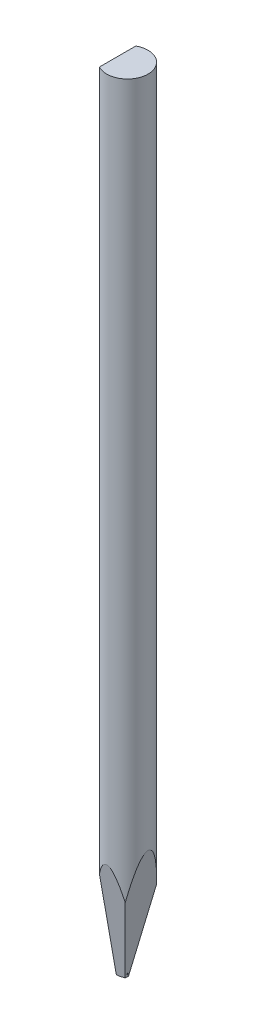
ISO-10303-21;
HEADER;
FILE_DESCRIPTION(('STEP AP214'),'2;1');
FILE_NAME('part.step','',(''),(''),'','','');
FILE_SCHEMA(('AUTOMOTIVE_DESIGN { 1 0 10303 214 1 1 1 1 }'));
ENDSEC;
DATA;
#1=APPLICATION_CONTEXT('core data for automotive mechanical design processes');
#2=APPLICATION_PROTOCOL_DEFINITION('international standard','automotive_design',2000,#1);
#3=PRODUCT_CONTEXT('',#1,'mechanical');
#4=PRODUCT('Part','Part','',(#3));
#5=PRODUCT_RELATED_PRODUCT_CATEGORY('part','',(#4));
#6=PRODUCT_DEFINITION_FORMATION('','',#4);
#7=PRODUCT_DEFINITION_CONTEXT('part definition',#1,'design');
#8=PRODUCT_DEFINITION('design','',#6,#7);
#9=PRODUCT_DEFINITION_SHAPE('','',#8);
#10=(LENGTH_UNIT() NAMED_UNIT(*) SI_UNIT(.MILLI.,.METRE.));
#11=(NAMED_UNIT(*) PLANE_ANGLE_UNIT() SI_UNIT($,.RADIAN.));
#12=(NAMED_UNIT(*) SI_UNIT($,.STERADIAN.) SOLID_ANGLE_UNIT());
#13=UNCERTAINTY_MEASURE_WITH_UNIT(LENGTH_MEASURE(1.E-05),#10,'distance_accuracy_value','');
#14=(GEOMETRIC_REPRESENTATION_CONTEXT(3) GLOBAL_UNCERTAINTY_ASSIGNED_CONTEXT((#13)) GLOBAL_UNIT_ASSIGNED_CONTEXT((#10,
#11,#12)) REPRESENTATION_CONTEXT('',''));
#15=CARTESIAN_POINT('',(0.,0.,0.));
#16=DIRECTION('',(0.,0.,1.));
#17=DIRECTION('',(1.,0.,0.));
#18=AXIS2_PLACEMENT_3D('',#15,#16,#17);
#19=CARTESIAN_POINT('',(38.6493213378097,0.,0.0508));
#20=DIRECTION('',(0.,-0.173648177666931,0.984807753012208));
#21=DIRECTION('',(0.,-0.984807753012208,-0.173648177666931));
#22=AXIS2_PLACEMENT_3D('',#19,#20,#21);
#23=PLANE('',#22);
#24=CARTESIAN_POINT('',(-0.35052,0.0254,0.0552787053099899));
#25=DIRECTION('',(0.,-0.173648177666931,0.984807753012208));
#26=DIRECTION('',(0.,-0.984807753012208,-0.173648177666931));
#27=AXIS2_PLACEMENT_3D('',#24,#25,#26);
#28=ELLIPSE('',#27,0.0257918359418979,0.0254);
#29=CARTESIAN_POINT('',(-0.35052,0.,0.0507999999999948));
#30=VERTEX_POINT('',#29);
#31=CARTESIAN_POINT('',(-0.37592,0.0254,0.0552787053099899));
#32=VERTEX_POINT('',#31);
#33=EDGE_CURVE('E237',#30,#32,#28,.F.);
#34=ORIENTED_EDGE('',*,*,#33,.F.);
#35=DIRECTION('',(-1.,0.,0.));
#36=VECTOR('',#35,1.);
#37=CARTESIAN_POINT('',(38.6493213378097,0.,0.0508));
#38=LINE('',#37,#36);
#39=CARTESIAN_POINT('',(-0.287020000000002,0.,0.0507999999999999));
#40=VERTEX_POINT('',#39);
#41=EDGE_CURVE('E304',#40,#30,#38,.T.);
#42=ORIENTED_EDGE('',*,*,#41,.F.);
#43=DIRECTION('',(-0.964921520309631,-0.258549942126377,-0.0455893306574928));
#44=VECTOR('',#43,1.);
#45=CARTESIAN_POINT('',(35.9655771779294,9.71385413735702,1.7636145710826));
#46=LINE('',#45,#44);
#47=CARTESIAN_POINT('',(-0.0204242374265309,0.0714341192871197,0.0633957625734663));
#48=VERTEX_POINT('',#47);
#49=EDGE_CURVE('E301',#48,#40,#46,.T.);
#50=ORIENTED_EDGE('',*,*,#49,.F.);
#51=DIRECTION('',(-0.171087869746036,-0.970287525247814,-0.171087869746036));
#52=VECTOR('',#51,1.);
#53=CARTESIAN_POINT('',(1.09925310229705,6.42143985989935,1.18307310229705));
#54=LINE('',#53,#52);
#55=CARTESIAN_POINT('',(0.516888556816318,3.11868640072457,0.600708556816316));
#56=VERTEX_POINT('',#55);
#57=EDGE_CURVE('E298',#56,#48,#54,.T.);
#58=ORIENTED_EDGE('',*,*,#57,.F.);
#59=CARTESIAN_POINT('',(0.,-0.288101116436578,0.));
#60=DIRECTION('',(0.,-0.173648177666931,0.984807753012208));
#61=DIRECTION('',(0.,-0.984807753012208,-0.173648177666931));
#62=AXIS2_PLACEMENT_3D('',#59,#60,#61);
#63=ELLIPSE('',#62,4.56371043248163,0.792479999999998);
#64=CARTESIAN_POINT('',(-0.37592,3.66844093071413,0.69764511322018));
#65=VERTEX_POINT('',#64);
#66=EDGE_CURVE('E309',#56,#65,#63,.T.);
#67=ORIENTED_EDGE('',*,*,#66,.T.);
#68=DIRECTION('',(0.,0.984807753012208,0.173648177666931));
#69=VECTOR('',#68,1.);
#70=CARTESIAN_POINT('',(-0.37592,29.414996070249,5.23745744461839));
#71=LINE('',#70,#69);
#72=EDGE_CURVE('E323',#32,#65,#71,.T.);
#73=ORIENTED_EDGE('',*,*,#72,.F.);
#74=EDGE_LOOP('',(#34,#42,#50,#58,#67,#73));
#75=FACE_BOUND('',#74,.T.);
#76=ADVANCED_FACE('F46',(#75),#23,.T.);
#77=CARTESIAN_POINT('',(38.6493213378097,0.,-0.0508));
#78=DIRECTION('',(0.,-0.173648177666931,-0.984807753012208));
#79=DIRECTION('',(0.,0.984807753012208,-0.173648177666931));
#80=AXIS2_PLACEMENT_3D('',#77,#78,#79);
#81=PLANE('',#80);
#82=CARTESIAN_POINT('',(-0.35052,0.0254,-0.0552787053099968));
#83=DIRECTION('',(0.,-0.173648177666931,-0.984807753012208));
#84=DIRECTION('',(0.,0.984807753012208,-0.173648177666931));
#85=AXIS2_PLACEMENT_3D('',#82,#83,#84);
#86=ELLIPSE('',#85,0.0257918359418979,0.0254);
#87=CARTESIAN_POINT('',(-0.37592,0.0254,-0.0552787053099968));
#88=VERTEX_POINT('',#87);
#89=CARTESIAN_POINT('',(-0.35052,0.,-0.0508000000000018));
#90=VERTEX_POINT('',#89);
#91=EDGE_CURVE('E234',#88,#90,#86,.F.);
#92=ORIENTED_EDGE('',*,*,#91,.F.);
#93=DIRECTION('',(0.,-0.984807753012208,0.173648177666931));
#94=VECTOR('',#93,1.);
#95=CARTESIAN_POINT('',(-0.37592,29.6894603880245,-5.28585290908397));
#96=LINE('',#95,#94);
#97=CARTESIAN_POINT('',(-0.37592,3.66844093071414,-0.69764511322018));
#98=VERTEX_POINT('',#97);
#99=EDGE_CURVE('E226',#98,#88,#96,.T.);
#100=ORIENTED_EDGE('',*,*,#99,.F.);
#101=CARTESIAN_POINT('',(0.,-0.288101116436578,0.));
#102=DIRECTION('',(0.,-0.173648177666931,-0.984807753012208));
#103=DIRECTION('',(0.,-0.984807753012208,0.173648177666931));
#104=AXIS2_PLACEMENT_3D('',#101,#102,#103);
#105=ELLIPSE('',#104,4.56371043248163,0.792479999999998);
#106=CARTESIAN_POINT('',(0.516888556816318,3.11868640072457,-0.600708556816316));
#107=VERTEX_POINT('',#106);
#108=EDGE_CURVE('E312',#98,#107,#105,.T.);
#109=ORIENTED_EDGE('',*,*,#108,.T.);
#110=DIRECTION('',(0.171087869746036,0.970287525247814,-0.171087869746036));
#111=VECTOR('',#110,1.);
#112=CARTESIAN_POINT('',(1.09925310229705,6.42143985989935,-1.18307310229705));
#113=LINE('',#112,#111);
#114=CARTESIAN_POINT('',(-0.0204242374265309,0.0714341192871197,-0.0633957625734663));
#115=VERTEX_POINT('',#114);
#116=EDGE_CURVE('E326',#115,#107,#113,.T.);
#117=ORIENTED_EDGE('',*,*,#116,.F.);
#118=DIRECTION('',(0.964921520309631,0.258549942126377,-0.0455893306574928));
#119=VECTOR('',#118,1.);
#120=CARTESIAN_POINT('',(35.9655771779294,9.71385413735702,-1.7636145710826));
#121=LINE('',#120,#119);
#122=CARTESIAN_POINT('',(-0.287020000000002,0.,-0.0507999999999999));
#123=VERTEX_POINT('',#122);
#124=EDGE_CURVE('E329',#123,#115,#121,.T.);
#125=ORIENTED_EDGE('',*,*,#124,.F.);
#126=DIRECTION('',(-1.,0.,0.));
#127=VECTOR('',#126,1.);
#128=CARTESIAN_POINT('',(38.6493213378097,0.,-0.0508));
#129=LINE('',#128,#127);
#130=EDGE_CURVE('E306',#123,#90,#129,.T.);
#131=ORIENTED_EDGE('',*,*,#130,.T.);
#132=EDGE_LOOP('',(#92,#100,#109,#117,#125,#131));
#133=FACE_BOUND('',#132,.T.);
#134=ADVANCED_FACE('F428',(#133),#81,.T.);
#135=CARTESIAN_POINT('',(38.5381963378097,-0.22352,0.));
#136=DIRECTION('',(-1.,0.,0.));
#137=DIRECTION('',(0.,0.,1.));
#138=AXIS2_PLACEMENT_3D('',#135,#136,#137);
#139=CYLINDRICAL_SURFACE('',#138,0.2286);
#140=DIRECTION('',(-1.,0.,0.));
#141=VECTOR('',#140,1.);
#142=CARTESIAN_POINT('',(38.5381963378097,0.,0.0479246241508475));
#143=LINE('',#142,#141);
#144=CARTESIAN_POINT('',(-0.287019999999999,0.,0.0479246241508475));
#145=VERTEX_POINT('',#144);
#146=CARTESIAN_POINT('',(-0.35052,0.,0.0479246241508472));
#147=VERTEX_POINT('',#146);
#148=EDGE_CURVE('E487',#145,#147,#143,.T.);
#149=ORIENTED_EDGE('',*,*,#148,.T.);
#150=CARTESIAN_POINT('',(-0.35052,0.,0.0479246241508474));
#151=CARTESIAN_POINT('',(-0.350900392402459,-3.3699656446361E-07,0.0479260510127039));
#152=CARTESIAN_POINT('',(-0.351278604095916,8.53064070227537E-06,0.0478848507766378));
#153=CARTESIAN_POINT('',(-0.352013991284435,4.14350259729038E-05,0.0477310606548525));
#154=CARTESIAN_POINT('',(-0.352371396182679,6.52438951644478E-05,0.0476195431058887));
#155=CARTESIAN_POINT('',(-0.353058191786254,0.000124762078876818,0.0473391942242351));
#156=CARTESIAN_POINT('',(-0.353387752720862,0.000160391338957975,0.0471707483032967));
#157=CARTESIAN_POINT('',(-0.35402051963647,0.00024035166189628,0.0467899962377382));
#158=CARTESIAN_POINT('',(-0.354323612831035,0.000284717569037879,0.0465775142806583));
#159=CARTESIAN_POINT('',(-0.355154813584528,0.000420369776502917,0.0459222927152313));
#160=CARTESIAN_POINT('',(-0.355650043988519,0.000518973431548806,0.0454397011406284));
#161=CARTESIAN_POINT('',(-0.356564934978039,0.000725402914897565,0.044409939798983));
#162=CARTESIAN_POINT('',(-0.356984361809818,0.000833255806419793,0.0438625786097486));
#163=CARTESIAN_POINT('',(-0.35840785319153,0.0012313679150053,0.0417979342150571));
#164=CARTESIAN_POINT('',(-0.359239328098428,0.00152997617862699,0.0401656120305819));
#165=CARTESIAN_POINT('',(-0.360671427087399,0.00210505774768753,0.0368009708633073));
#166=CARTESIAN_POINT('',(-0.361270725352585,0.00238139699260226,0.0350681407157026));
#167=CARTESIAN_POINT('',(-0.363315708658562,0.00338867321792595,0.0282234718555884));
#168=CARTESIAN_POINT('',(-0.364212825533207,0.00398857534403333,0.0229318897617975));
#169=CARTESIAN_POINT('',(-0.36540977297981,0.00481532280906211,0.0122559733834192));
#170=CARTESIAN_POINT('',(-0.365706661600581,0.00504032969966517,0.00687131208907248));
#171=CARTESIAN_POINT('',(-0.365804231111271,0.00511281669556783,-0.00433303486399985));
#172=CARTESIAN_POINT('',(-0.365563730209588,0.00492897018438943,-0.0101533831225549));
#173=CARTESIAN_POINT('',(-0.364418682051404,0.00412211763392509,-0.0216706708043537));
#174=CARTESIAN_POINT('',(-0.363520297156574,0.00350318912365435,-0.027368253740592));
#175=CARTESIAN_POINT('',(-0.361363325948669,0.00242330136915632,-0.034807015181528));
#176=CARTESIAN_POINT('',(-0.36070935822941,0.00211732557996326,-0.0367329998360351));
#177=CARTESIAN_POINT('',(-0.359450031373804,0.00161647218047091,-0.0396572524807727));
#178=CARTESIAN_POINT('',(-0.358944087383327,0.00143021935272225,-0.0406991761112497));
#179=CARTESIAN_POINT('',(-0.35779888135061,0.0010577045493934,-0.0427063742059296));
#180=CARTESIAN_POINT('',(-0.357160279779858,0.000871447025331379,-0.043671996861833));
#181=CARTESIAN_POINT('',(-0.35613290320055,0.000626206151421614,-0.0449062212739764));
#182=CARTESIAN_POINT('',(-0.355827812779895,0.000558600774716911,-0.0452420983649299));
#183=CARTESIAN_POINT('',(-0.355180489938966,0.000429021783071031,-0.045879191263965));
#184=CARTESIAN_POINT('',(-0.354838192429641,0.000367058397573567,-0.0461803443675138));
#185=CARTESIAN_POINT('',(-0.354106666695822,0.000251737264828465,-0.0467359766581451));
#186=CARTESIAN_POINT('',(-0.353716784394451,0.000198530377321173,-0.0469896462914512));
#187=CARTESIAN_POINT('',(-0.352895508943542,0.000108008827291845,-0.0474185836495885));
#188=CARTESIAN_POINT('',(-0.352464401912635,7.05931702166418E-05,-0.0475943499880559));
#189=CARTESIAN_POINT('',(-0.351775797612198,2.98981426686763E-05,-0.0477850185512582));
#190=CARTESIAN_POINT('',(-0.351528812846676,1.88326864157087E-05,-0.0478367267501532));
#191=CARTESIAN_POINT('',(-0.351028058819746,3.81883727636853E-06,-0.0479068141076735));
#192=CARTESIAN_POINT('',(-0.35077425201649,-7.42325082539725E-08,-0.047924934196069));
#193=CARTESIAN_POINT('',(-0.350520000002334,-7.33729139783165E-13,-0.0479246241591208));
#194=B_SPLINE_CURVE_WITH_KNOTS('',3,(#150,#151,#152,#153,#154,#155,#156,#157,#158,#159,#160,
#161,#162,#163,#164,#165,#166,#167,#168,#169,#170,#171,#172,#173,#174,#175,#176,#177,#178,#179,
#180,#181,#182,#183,#184,#185,#186,#187,#188,#189,#190,#191,#192,#193),.UNSPECIFIED.,.F.,.F.,(4,
2,2,2,2,2,2,2,2,2,2,2,2,2,2,2,2,2,2,2,2,4),(0.,0.00113540512164321,0.00225390077315684,
0.00336497091736988,0.00448056551341547,0.00656387329625069,0.00865349961429956,
0.014178824173064,0.0197352510547102,0.0358225730862485,0.051988555996617,0.0694354758656038,
0.0867210285587695,0.0928740436946335,0.096388479843597,0.0998858206918457,0.101260028053703,
0.102636679329949,0.104035006362812,0.105424249505913,0.106179770798547,0.106941095675409),.UNSPECIFIED.);
#195=CARTESIAN_POINT('',(-0.362559326753374,0.00304296403628652,0.0304435896219013));
#196=VERTEX_POINT('',#195);
#197=EDGE_CURVE('E235',#147,#196,#194,.T.);
#198=ORIENTED_EDGE('',*,*,#197,.T.);
#199=CARTESIAN_POINT('',(-0.37592,0.,-0.0479246241508474));
#200=CARTESIAN_POINT('',(-0.363217711722811,0.00337373202194929,-0.0321895694705539));
#201=CARTESIAN_POINT('',(-0.35052,0.00507999999999999,-0.016094217753857));
#202=CARTESIAN_POINT('',(-0.35052,0.00508000000000001,0.0160942177538567));
#203=CARTESIAN_POINT('',(-0.363217711722811,0.00337373202194924,0.0321895694705541));
#204=CARTESIAN_POINT('',(-0.37592,0.,0.0479246241508475));
#205=(BOUNDED_CURVE() B_SPLINE_CURVE(3,(#199,#200,#201,#202,#203,#204),.UNSPECIFIED.,.F.,
.F.) B_SPLINE_CURVE_WITH_KNOTS((4,2,4),(1.35958544643572,1.5707963267949,1.78200720715407),
.UNSPECIFIED.) CURVE() GEOMETRIC_REPRESENTATION_ITEM() RATIONAL_B_SPLINE_CURVE((1.,1.,1.,1.,1.,1.)) REPRESENTATION_ITEM(''));
#206=CARTESIAN_POINT('',(-0.362559279438174,0.0030429595754462,-0.0304436228711777));
#207=VERTEX_POINT('',#206);
#208=EDGE_CURVE('E218',#196,#207,#205,.F.);
#209=ORIENTED_EDGE('',*,*,#208,.T.);
#210=CARTESIAN_POINT('',(-0.35052,0.,-0.0479246241508472));
#211=VERTEX_POINT('',#210);
#212=EDGE_CURVE('E79',#207,#211,#194,.T.);
#213=ORIENTED_EDGE('',*,*,#212,.T.);
#214=DIRECTION('',(-1.,0.,0.));
#215=VECTOR('',#214,1.);
#216=CARTESIAN_POINT('',(38.5381963378097,0.,-0.0479246241508475));
#217=LINE('',#216,#215);
#218=CARTESIAN_POINT('',(-0.28702,0.,-0.0479246241508399));
#219=VERTEX_POINT('',#218);
#220=EDGE_CURVE('E291',#219,#211,#217,.T.);
#221=ORIENTED_EDGE('',*,*,#220,.F.);
#222=CARTESIAN_POINT('',(-1.12120799650779,-0.22352,0.));
#223=DIRECTION('',(-0.258819045102522,0.965925826289068,0.));
#224=DIRECTION('',(-0.965925826289068,-0.258819045102522,0.));
#225=AXIS2_PLACEMENT_3D('',#222,#223,#224);
#226=ELLIPSE('',#225,0.883242575558721,0.2286);
#227=CARTESIAN_POINT('',(-0.273887212551109,0.00351891979129921,-0.02667));
#228=VERTEX_POINT('',#227);
#229=EDGE_CURVE('E332',#228,#219,#226,.T.);
#230=ORIENTED_EDGE('',*,*,#229,.F.);
#231=DIRECTION('',(-1.,0.,0.));
#232=VECTOR('',#231,1.);
#233=CARTESIAN_POINT('',(38.5381963378097,0.00351891979129921,-0.02667));
#234=LINE('',#233,#232);
#235=CARTESIAN_POINT('',(-0.292292487352664,0.0035189197912985,-0.02667));
#236=VERTEX_POINT('',#235);
#237=EDGE_CURVE('E336',#228,#236,#234,.T.);
#238=ORIENTED_EDGE('',*,*,#237,.T.);
#239=CARTESIAN_POINT('',(-0.292292487352662,0.00351891979129973,-0.02667));
#240=CARTESIAN_POINT('',(-0.294159133125869,0.003518159195896,-0.0266706567241666));
#241=CARTESIAN_POINT('',(-0.296028383825725,0.00353615603344976,-0.0265229768754812));
#242=CARTESIAN_POINT('',(-0.29972646008727,0.00360582340980763,-0.0259229101762103));
#243=CARTESIAN_POINT('',(-0.301555018614739,0.00365767206582619,-0.0254689111495243));
#244=CARTESIAN_POINT('',(-0.305110893993561,0.00379134334791496,-0.0242460234448038));
#245=CARTESIAN_POINT('',(-0.306837860267251,0.00387326342523699,-0.0234761100291968));
#246=CARTESIAN_POINT('',(-0.310113058624686,0.00405657236445857,-0.021626978102043));
#247=CARTESIAN_POINT('',(-0.311661696702835,0.00415791554503001,-0.0205484824701733));
#248=CARTESIAN_POINT('',(-0.314366351002873,0.00435481952405887,-0.0182273175130638));
#249=CARTESIAN_POINT('',(-0.315546284407866,0.00444991926524405,-0.0170125238249045));
#250=CARTESIAN_POINT('',(-0.31765446688604,0.00463108516755398,-0.0143796619896594));
#251=CARTESIAN_POINT('',(-0.318582807117894,0.00471715459364799,-0.0129616677528072));
#252=CARTESIAN_POINT('',(-0.320054623079399,0.00485905615401766,-0.0101360336333869));
#253=CARTESIAN_POINT('',(-0.320629412638132,0.00491718615445311,-0.00874477002837476));
#254=CARTESIAN_POINT('',(-0.32151919899582,0.00500881752552277,-0.00588094323398927));
#255=CARTESIAN_POINT('',(-0.321834345501121,0.00504233308726611,-0.00440842741680027));
#256=CARTESIAN_POINT('',(-0.322179164404535,0.00507910076342201,-0.00153068277597401));
#257=CARTESIAN_POINT('',(-0.322226590604222,0.00508423449874323,-0.000127578202503849));
#258=CARTESIAN_POINT('',(-0.322081817385826,0.00506871896720472,0.00266594410626954));
#259=CARTESIAN_POINT('',(-0.321889655322603,0.00504807371961579,0.00405636378526576));
#260=CARTESIAN_POINT('',(-0.321278879852332,0.00498397945012088,0.006759306656321));
#261=CARTESIAN_POINT('',(-0.320864412517548,0.00494094836089125,0.00807278240477616));
#262=CARTESIAN_POINT('',(-0.319827046485066,0.0048370203680076,0.0106136684950106));
#263=CARTESIAN_POINT('',(-0.319204135780104,0.00477612243516884,0.011841073873826));
#264=CARTESIAN_POINT('',(-0.317752755332898,0.00464102471597193,0.0142110635362983));
#265=CARTESIAN_POINT('',(-0.31691934000204,0.00456651895293945,0.0153505937106573));
#266=CARTESIAN_POINT('',(-0.315084000807191,0.00441292804823238,0.0174838997312444));
#267=CARTESIAN_POINT('',(-0.314082045655645,0.00433384205807991,0.0184776484505126));
#268=CARTESIAN_POINT('',(-0.311869044364478,0.00417332834974892,0.0203633026892978));
#269=CARTESIAN_POINT('',(-0.310648547225411,0.00409209221839234,0.0212441105817829));
#270=CARTESIAN_POINT('',(-0.30808725581177,0.00394049681056354,0.0228101595533078));
#271=CARTESIAN_POINT('',(-0.306746390085597,0.00387014406291765,0.0234952834505308));
#272=CARTESIAN_POINT('',(-0.303841200769342,0.00373998592647261,0.0247240364532774));
#273=CARTESIAN_POINT('',(-0.302267938639826,0.00368193802392801,0.0252466736327182));
#274=CARTESIAN_POINT('',(-0.299061905300299,0.00359117317113496,0.0260508603316775));
#275=CARTESIAN_POINT('',(-0.297429167892537,0.0035584420604427,0.026332544632747));
#276=CARTESIAN_POINT('',(-0.294624327799112,0.00352561816265422,0.0266127151337486));
#277=CARTESIAN_POINT('',(-0.293457960808819,0.00351875791616096,0.0266701221503605));
#278=CARTESIAN_POINT('',(-0.292292487352664,0.00351891979129691,0.0266700000000205));
#279=B_SPLINE_CURVE_WITH_KNOTS('',3,(#239,#240,#241,#242,#243,#244,#245,#246,#247,#248,#249,
#250,#251,#252,#253,#254,#255,#256,#257,#258,#259,#260,#261,#262,#263,#264,#265,#266,#267,#268,
#269,#270,#271,#272,#273,#274,#275,#276,#277,#278),.UNSPECIFIED.,.F.,.F.,(4,2,2,2,2,2,2,2,2,2,2,
2,2,2,2,2,2,2,2,4),(0.,0.00559810117895607,0.0112258977290727,0.0168720954234149,
0.0225051732247499,0.0275650085548042,0.0326230081180122,0.0371186649510377,0.0416117278371305,
0.0458029845449567,0.0499935878642248,0.0541086222821138,0.0582238937851003,0.0624466887694947,
0.0666702685360261,0.0711734594715936,0.0756793414345881,0.0806356693451407,0.0855892230235627,
0.0890860847152416),.UNSPECIFIED.);
#280=CARTESIAN_POINT('',(-0.321450604675297,0.0050020315614242,-0.005970016));
#281=VERTEX_POINT('',#280);
#282=EDGE_CURVE('E340',#236,#281,#279,.T.);
#283=ORIENTED_EDGE('',*,*,#282,.T.);
#284=DIRECTION('',(-1.,0.,0.));
#285=VECTOR('',#284,1.);
#286=CARTESIAN_POINT('',(38.5381963378097,0.00500203156142241,-0.005970016));
#287=LINE('',#286,#285);
#288=CARTESIAN_POINT('',(-0.327922770396879,0.00500203156142185,-0.005970016));
#289=VERTEX_POINT('',#288);
#290=EDGE_CURVE('E269',#289,#281,#287,.F.);
#291=ORIENTED_EDGE('',*,*,#290,.F.);
#292=CARTESIAN_POINT('',(-1.18077860283299,-0.22352,0.));
#293=DIRECTION('',(-0.258819045102515,0.96592582628907,0.));
#294=DIRECTION('',(-0.96592582628907,-0.258819045102515,0.));
#295=AXIS2_PLACEMENT_3D('',#292,#293,#294);
#296=ELLIPSE('',#295,0.883242575558744,0.2286);
#297=CARTESIAN_POINT('',(-0.327922770396879,0.00500203156142185,0.005970016));
#298=VERTEX_POINT('',#297);
#299=EDGE_CURVE('E271',#289,#298,#296,.F.);
#300=ORIENTED_EDGE('',*,*,#299,.T.);
#301=DIRECTION('',(-1.,0.,0.));
#302=VECTOR('',#301,1.);
#303=CARTESIAN_POINT('',(38.5381963378097,0.00500203156142241,0.005970016));
#304=LINE('',#303,#302);
#305=CARTESIAN_POINT('',(-0.321450604675297,0.0050020315614242,0.005970016));
#306=VERTEX_POINT('',#305);
#307=EDGE_CURVE('E266',#298,#306,#304,.F.);
#308=ORIENTED_EDGE('',*,*,#307,.T.);
#309=CARTESIAN_POINT('',(-0.292292487352659,0.00351891979129994,0.02667));
#310=VERTEX_POINT('',#309);
#311=EDGE_CURVE('E339',#306,#310,#279,.T.);
#312=ORIENTED_EDGE('',*,*,#311,.T.);
#313=DIRECTION('',(-1.,0.,0.));
#314=VECTOR('',#313,1.);
#315=CARTESIAN_POINT('',(38.5381963378097,0.00351891979129921,0.02667));
#316=LINE('',#315,#314);
#317=CARTESIAN_POINT('',(-0.273887212551109,0.00351891979129921,0.02667));
#318=VERTEX_POINT('',#317);
#319=EDGE_CURVE('E348',#318,#310,#316,.T.);
#320=ORIENTED_EDGE('',*,*,#319,.F.);
#321=EDGE_CURVE('E333',#145,#318,#226,.T.);
#322=ORIENTED_EDGE('',*,*,#321,.F.);
#323=EDGE_LOOP('',(#149,#198,#209,#213,#221,#230,#238,#283,#291,#300,#308,#312,#320,#322));
#324=FACE_BOUND('',#323,.T.);
#325=ADVANCED_FACE('F350',(#324),#139,.F.);
#326=CARTESIAN_POINT('',(-0.241531228026725,0.09144,0.));
#327=DIRECTION('',(-0.500000000000004,-0.866025403784436,0.));
#328=DIRECTION('',(0.866025403784436,-0.500000000000004,0.));
#329=AXIS2_PLACEMENT_3D('',#326,#327,#328);
#330=CYLINDRICAL_SURFACE('',#329,0.02667);
#331=DIRECTION('',(-0.500000000000004,-0.866025403784436,0.));
#332=VECTOR('',#331,1.);
#333=CARTESIAN_POINT('',(-0.264042022253491,0.104436613106496,-0.005970016));
#334=LINE('',#333,#332);
#335=CARTESIAN_POINT('',(-0.321190606325167,0.0054523619137331,-0.005970016));
#336=VERTEX_POINT('',#335);
#337=EDGE_CURVE('E485',#281,#336,#334,.F.);
#338=ORIENTED_EDGE('',*,*,#337,.F.);
#339=ORIENTED_EDGE('',*,*,#282,.F.);
#340=DIRECTION('',(0.500000000000004,0.866025403784436,0.));
#341=VECTOR('',#340,1.);
#342=CARTESIAN_POINT('',(-0.241531228026725,0.09144,-0.02667));
#343=LINE('',#342,#341);
#344=CARTESIAN_POINT('',(-0.241531228026725,0.09144,-0.02667));
#345=VERTEX_POINT('',#344);
#346=EDGE_CURVE('E539',#236,#345,#343,.T.);
#347=ORIENTED_EDGE('',*,*,#346,.T.);
#348=CARTESIAN_POINT('',(-0.241531228026725,0.09144,0.));
#349=DIRECTION('',(0.,-1.,0.));
#350=DIRECTION('',(-1.,0.,0.));
#351=AXIS2_PLACEMENT_3D('',#348,#349,#350);
#352=ELLIPSE('',#351,0.0307958633585747,0.02667);
#353=CARTESIAN_POINT('',(-0.241531228026725,0.09144,0.02667));
#354=VERTEX_POINT('',#353);
#355=EDGE_CURVE('E502',#345,#354,#352,.F.);
#356=ORIENTED_EDGE('',*,*,#355,.T.);
#357=DIRECTION('',(-0.500000000000004,-0.866025403784436,0.));
#358=VECTOR('',#357,1.);
#359=CARTESIAN_POINT('',(-0.220743102481068,0.127446089639199,0.02667));
#360=LINE('',#359,#358);
#361=EDGE_CURVE('E544',#354,#310,#360,.T.);
#362=ORIENTED_EDGE('',*,*,#361,.T.);
#363=ORIENTED_EDGE('',*,*,#311,.F.);
#364=DIRECTION('',(-0.500000000000004,-0.866025403784436,0.));
#365=VECTOR('',#364,1.);
#366=CARTESIAN_POINT('',(-0.264042022253491,0.104436613106496,0.005970016));
#367=LINE('',#366,#365);
#368=CARTESIAN_POINT('',(-0.321190606325167,0.00545236191373301,0.005970016));
#369=VERTEX_POINT('',#368);
#370=EDGE_CURVE('E518',#306,#369,#367,.F.);
#371=ORIENTED_EDGE('',*,*,#370,.T.);
#372=CARTESIAN_POINT('',(-0.321190606325167,-0.0465340905122493,0.));
#373=DIRECTION('',(1.,0.,0.));
#374=DIRECTION('',(0.,-1.,0.));
#375=AXIS2_PLACEMENT_3D('',#372,#373,#374);
#376=ELLIPSE('',#375,0.0533399999999996,0.02667);
#377=CARTESIAN_POINT('',(-0.321190606325167,0.00680590948775038,0.));
#378=VERTEX_POINT('',#377);
#379=EDGE_CURVE('E524',#369,#378,#376,.F.);
#380=ORIENTED_EDGE('',*,*,#379,.T.);
#381=EDGE_CURVE('E527',#378,#336,#376,.F.);
#382=ORIENTED_EDGE('',*,*,#381,.T.);
#383=EDGE_LOOP('',(#338,#339,#347,#356,#362,#363,#371,#380,#382));
#384=FACE_BOUND('',#383,.T.);
#385=ADVANCED_FACE('F354',(#384),#330,.F.);
#386=CARTESIAN_POINT('',(-0.28702,0.,39.0514777293349));
#387=DIRECTION('',(-0.258819045102522,0.965925826289068,0.));
#388=DIRECTION('',(-0.965925826289068,-0.258819045102522,0.));
#389=AXIS2_PLACEMENT_3D('',#386,#387,#388);
#390=PLANE('',#389);
#391=DIRECTION('',(-0.965925826289068,-0.258819045102522,0.));
#392=VECTOR('',#391,1.);
#393=CARTESIAN_POINT('',(-0.28702,0.,0.0266699999999995));
#394=LINE('',#393,#392);
#395=CARTESIAN_POINT('',(-0.1397,0.0394742750289531,0.0266699999999997));
#396=VERTEX_POINT('',#395);
#397=EDGE_CURVE('E494',#396,#318,#394,.T.);
#398=ORIENTED_EDGE('',*,*,#397,.F.);
#399=DIRECTION('',(0.,0.,1.));
#400=VECTOR('',#399,1.);
#401=CARTESIAN_POINT('',(-0.1397,0.0394742750289531,39.0514777293349));
#402=LINE('',#401,#400);
#403=CARTESIAN_POINT('',(-0.1397,0.0394742750289531,-0.0266699999999997));
#404=VERTEX_POINT('',#403);
#405=EDGE_CURVE('E511',#404,#396,#402,.T.);
#406=ORIENTED_EDGE('',*,*,#405,.F.);
#407=DIRECTION('',(-0.965925826289068,-0.258819045102522,0.));
#408=VECTOR('',#407,1.);
#409=CARTESIAN_POINT('',(-0.28702,0.,-0.0266699999999995));
#410=LINE('',#409,#408);
#411=EDGE_CURVE('E496',#404,#228,#410,.T.);
#412=ORIENTED_EDGE('',*,*,#411,.T.);
#413=ORIENTED_EDGE('',*,*,#229,.T.);
#414=DIRECTION('',(0.,0.,-1.));
#415=VECTOR('',#414,1.);
#416=CARTESIAN_POINT('',(-0.28702,0.,39.0514777293349));
#417=LINE('',#416,#415);
#418=EDGE_CURVE('E290',#219,#123,#417,.T.);
#419=ORIENTED_EDGE('',*,*,#418,.T.);
#420=ORIENTED_EDGE('',*,*,#124,.T.);
#421=DIRECTION('',(0.,0.,-1.));
#422=VECTOR('',#421,1.);
#423=CARTESIAN_POINT('',(-0.0204242374265339,0.0714341192871198,39.0514777293349));
#424=LINE('',#423,#422);
#425=EDGE_CURVE('E287',#48,#115,#424,.T.);
#426=ORIENTED_EDGE('',*,*,#425,.F.);
#427=ORIENTED_EDGE('',*,*,#49,.T.);
#428=EDGE_CURVE('E292',#40,#145,#417,.T.);
#429=ORIENTED_EDGE('',*,*,#428,.T.);
#430=ORIENTED_EDGE('',*,*,#321,.T.);
#431=EDGE_LOOP('',(#398,#406,#412,#413,#419,#420,#426,#427,#429,#430));
#432=FACE_BOUND('',#431,.T.);
#433=ADVANCED_FACE('F360',(#432),#390,.F.);
#434=CARTESIAN_POINT('',(-0.0204242374265339,0.0714341192871198,39.0514777293349));
#435=DIRECTION('',(-0.984807753012208,0.173648177666931,0.));
#436=DIRECTION('',(-0.173648177666931,-0.984807753012208,0.));
#437=AXIS2_PLACEMENT_3D('',#434,#435,#436);
#438=PLANE('',#437);
#439=CARTESIAN_POINT('',(0.,0.187265725683772,0.));
#440=DIRECTION('',(-0.984807753012208,0.173648177666931,0.));
#441=DIRECTION('',(-0.173648177666931,-0.984807753012208,0.));
#442=AXIS2_PLACEMENT_3D('',#439,#440,#441);
#443=ELLIPSE('',#442,4.56371043248165,0.792479999999998);
#444=EDGE_CURVE('E295',#56,#107,#443,.T.);
#445=ORIENTED_EDGE('',*,*,#444,.F.);
#446=ORIENTED_EDGE('',*,*,#57,.T.);
#447=ORIENTED_EDGE('',*,*,#425,.T.);
#448=ORIENTED_EDGE('',*,*,#116,.T.);
#449=EDGE_LOOP('',(#445,#446,#447,#448));
#450=FACE_BOUND('',#449,.T.);
#451=CARTESIAN_POINT('',(-0.000954627730623748,0.181851762790587,0.));
#452=DIRECTION('',(-0.984807753012208,0.173648177666931,0.));
#453=DIRECTION('',(0.173648177666931,0.984807753012208,0.));
#454=AXIS2_PLACEMENT_3D('',#451,#452,#453);
#455=ELLIPSE('',#454,0.0335254540060615,0.0240808533337932);
#456=CARTESIAN_POINT('',(-0.00527998647492472,0.157321434380709,-0.0161176379343666));
#457=VERTEX_POINT('',#456);
#458=CARTESIAN_POINT('',(-0.00527998647492472,0.157321434380709,0.0161176379343666));
#459=VERTEX_POINT('',#458);
#460=EDGE_CURVE('E512',#457,#459,#455,.F.);
#461=ORIENTED_EDGE('',*,*,#460,.F.);
#462=CARTESIAN_POINT('',(-0.00527998647492472,0.157321434380709,-0.016117637934368));
#463=CARTESIAN_POINT('',(-0.0108003699816548,0.126013783761674,0.));
#464=CARTESIAN_POINT('',(-0.00527998647492472,0.157321434380709,0.016117637934368));
#465=B_SPLINE_CURVE_WITH_KNOTS('',2,(#462,#463,#464),.UNSPECIFIED.,.F.,.F.,(3,3),(0.,1.),.UNSPECIFIED.);
#466=EDGE_CURVE('E507',#457,#459,#465,.T.);
#467=ORIENTED_EDGE('',*,*,#466,.T.);
#468=EDGE_LOOP('',(#461,#467));
#469=FACE_BOUND('',#468,.T.);
#470=ADVANCED_FACE('F434',(#450,#469),#438,.F.);
#471=CARTESIAN_POINT('',(0.,0.,0.));
#472=DIRECTION('',(0.,1.,0.));
#473=DIRECTION('',(0.,0.,1.));
#474=AXIS2_PLACEMENT_3D('',#471,#472,#473);
#475=PLANE('',#474);
#476=ORIENTED_EDGE('',*,*,#41,.T.);
#477=DIRECTION('',(0.,0.,-1.));
#478=VECTOR('',#477,1.);
#479=CARTESIAN_POINT('',(-0.35052,0.,38.2458036754195));
#480=LINE('',#479,#478);
#481=EDGE_CURVE('E71',#30,#147,#480,.T.);
#482=ORIENTED_EDGE('',*,*,#481,.T.);
#483=ORIENTED_EDGE('',*,*,#148,.F.);
#484=ORIENTED_EDGE('',*,*,#428,.F.);
#485=EDGE_LOOP('',(#476,#482,#483,#484));
#486=FACE_BOUND('',#485,.T.);
#487=ADVANCED_FACE('F567',(#486),#475,.F.);
#488=ORIENTED_EDGE('',*,*,#220,.T.);
#489=EDGE_CURVE('E233',#211,#90,#480,.T.);
#490=ORIENTED_EDGE('',*,*,#489,.T.);
#491=ORIENTED_EDGE('',*,*,#130,.F.);
#492=ORIENTED_EDGE('',*,*,#418,.F.);
#493=EDGE_LOOP('',(#488,#490,#491,#492));
#494=FACE_BOUND('',#493,.T.);
#495=ADVANCED_FACE('F424',(#494),#475,.F.);
#496=CARTESIAN_POINT('',(0.,30.48,0.));
#497=DIRECTION('',(0.,-1.,0.));
#498=DIRECTION('',(0.,0.,-1.));
#499=AXIS2_PLACEMENT_3D('',#496,#497,#498);
#500=CYLINDRICAL_SURFACE('',#499,0.792479999999998);
#501=ORIENTED_EDGE('',*,*,#66,.F.);
#502=ORIENTED_EDGE('',*,*,#444,.T.);
#503=ORIENTED_EDGE('',*,*,#108,.F.);
#504=DIRECTION('',(0.,-1.,0.));
#505=VECTOR('',#504,1.);
#506=CARTESIAN_POINT('',(-0.37592,30.48,-0.69764511322018));
#507=LINE('',#506,#505);
#508=CARTESIAN_POINT('',(-0.37592,30.48,-0.69764511322018));
#509=VERTEX_POINT('',#508);
#510=EDGE_CURVE('E318',#509,#98,#507,.T.);
#511=ORIENTED_EDGE('',*,*,#510,.F.);
#512=CARTESIAN_POINT('',(0.,30.48,0.));
#513=DIRECTION('',(0.,1.,0.));
#514=DIRECTION('',(0.,0.,1.));
#515=AXIS2_PLACEMENT_3D('',#512,#513,#514);
#516=CIRCLE('',#515,0.792479999999998);
#517=CARTESIAN_POINT('',(-0.37592,30.48,0.69764511322018));
#518=VERTEX_POINT('',#517);
#519=EDGE_CURVE('E320',#518,#509,#516,.T.);
#520=ORIENTED_EDGE('',*,*,#519,.F.);
#521=DIRECTION('',(0.,-1.,0.));
#522=VECTOR('',#521,1.);
#523=CARTESIAN_POINT('',(-0.37592,30.48,0.69764511322018));
#524=LINE('',#523,#522);
#525=EDGE_CURVE('E316',#65,#518,#524,.F.);
#526=ORIENTED_EDGE('',*,*,#525,.F.);
#527=EDGE_LOOP('',(#501,#502,#503,#511,#520,#526));
#528=FACE_BOUND('',#527,.T.);
#529=ADVANCED_FACE('F441',(#528),#500,.T.);
#530=CARTESIAN_POINT('',(-0.37592,30.48,-0.80247998));
#531=DIRECTION('',(-1.,0.,0.));
#532=DIRECTION('',(0.,0.,1.));
#533=AXIS2_PLACEMENT_3D('',#530,#531,#532);
#534=PLANE('',#533);
#535=DIRECTION('',(0.,0.,-1.));
#536=VECTOR('',#535,1.);
#537=CARTESIAN_POINT('',(-0.37592,0.0254,38.2458036754195));
#538=LINE('',#537,#536);
#539=CARTESIAN_POINT('',(-0.37592,0.0254003737438903,0.0189702481112685));
#540=VERTEX_POINT('',#539);
#541=EDGE_CURVE('E229',#32,#540,#538,.T.);
#542=ORIENTED_EDGE('',*,*,#541,.F.);
#543=ORIENTED_EDGE('',*,*,#72,.T.);
#544=ORIENTED_EDGE('',*,*,#525,.T.);
#545=DIRECTION('',(0.,0.,-1.));
#546=VECTOR('',#545,1.);
#547=CARTESIAN_POINT('',(-0.37592,30.48,-0.80247998));
#548=LINE('',#547,#546);
#549=EDGE_CURVE('E314',#518,#509,#548,.T.);
#550=ORIENTED_EDGE('',*,*,#549,.T.);
#551=ORIENTED_EDGE('',*,*,#510,.T.);
#552=ORIENTED_EDGE('',*,*,#99,.T.);
#553=CARTESIAN_POINT('',(-0.37592,0.0253947462111373,-0.0187712309905425));
#554=VERTEX_POINT('',#553);
#555=EDGE_CURVE('E223',#554,#88,#538,.T.);
#556=ORIENTED_EDGE('',*,*,#555,.F.);
#557=CARTESIAN_POINT('',(-0.37592,0.,0.0479246241508475));
#558=CARTESIAN_POINT('',(-0.37592,0.0156346693452842,0.0349843988859232));
#559=CARTESIAN_POINT('',(-0.37592,0.0304800000000063,0.0178813214901503));
#560=CARTESIAN_POINT('',(-0.37592,0.0304800000000063,-0.0178813214901506));
#561=CARTESIAN_POINT('',(-0.37592,0.0156346693452842,-0.0349843988859231));
#562=CARTESIAN_POINT('',(-0.37592,0.,-0.0479246241508474));
#563=(BOUNDED_CURVE() B_SPLINE_CURVE(3,(#557,#558,#559,#560,#561,#562),.UNSPECIFIED.,.F.,
.F.) B_SPLINE_CURVE_WITH_KNOTS((4,2,4),(1.35958544643572,1.5707963267949,1.78200720715407),
.UNSPECIFIED.) CURVE() GEOMETRIC_REPRESENTATION_ITEM() RATIONAL_B_SPLINE_CURVE((1.,1.,1.,1.,1.,1.)) REPRESENTATION_ITEM(''));
#564=EDGE_CURVE('E211',#554,#540,#563,.F.);
#565=ORIENTED_EDGE('',*,*,#564,.T.);
#566=EDGE_LOOP('',(#542,#543,#544,#550,#551,#552,#556,#565));
#567=FACE_BOUND('',#566,.T.);
#568=ADVANCED_FACE('F224',(#567),#534,.T.);
#569=CARTESIAN_POINT('',(0.,30.48,0.));
#570=DIRECTION('',(0.,1.,0.));
#571=DIRECTION('',(0.,0.,1.));
#572=AXIS2_PLACEMENT_3D('',#569,#570,#571);
#573=PLANE('',#572);
#574=ORIENTED_EDGE('',*,*,#519,.T.);
#575=ORIENTED_EDGE('',*,*,#549,.F.);
#576=EDGE_LOOP('',(#574,#575));
#577=FACE_BOUND('',#576,.T.);
#578=ADVANCED_FACE('F372',(#577),#573,.T.);
#579=CARTESIAN_POINT('',(-0.1397,0.09144,0.02667));
#580=DIRECTION('',(-1.,0.,0.));
#581=DIRECTION('',(0.,-1.,0.));
#582=AXIS2_PLACEMENT_3D('',#579,#580,#581);
#583=PLANE('',#582);
#584=ORIENTED_EDGE('',*,*,#405,.T.);
#585=DIRECTION('',(0.,1.,0.));
#586=VECTOR('',#585,1.);
#587=CARTESIAN_POINT('',(-0.1397,0.09144,0.02667));
#588=LINE('',#587,#586);
#589=CARTESIAN_POINT('',(-0.1397,0.09144,0.02667));
#590=VERTEX_POINT('',#589);
#591=EDGE_CURVE('E560',#396,#590,#588,.T.);
#592=ORIENTED_EDGE('',*,*,#591,.T.);
#593=DIRECTION('',(0.,0.,-1.));
#594=VECTOR('',#593,1.);
#595=CARTESIAN_POINT('',(-0.1397,0.09144,0.02667));
#596=LINE('',#595,#594);
#597=CARTESIAN_POINT('',(-0.1397,0.09144,0.01905));
#598=VERTEX_POINT('',#597);
#599=EDGE_CURVE('E563',#590,#598,#596,.T.);
#600=ORIENTED_EDGE('',*,*,#599,.T.);
#601=CARTESIAN_POINT('',(-0.1397,0.0914400000000001,0.));
#602=DIRECTION('',(1.,0.,0.));
#603=DIRECTION('',(0.,1.,0.));
#604=AXIS2_PLACEMENT_3D('',#601,#602,#603);
#605=ELLIPSE('',#604,0.0219970452561247,0.01905);
#606=CARTESIAN_POINT('',(-0.1397,0.09144,-0.0190499999999996));
#607=VERTEX_POINT('',#606);
#608=EDGE_CURVE('E555',#607,#598,#605,.F.);
#609=ORIENTED_EDGE('',*,*,#608,.F.);
#610=CARTESIAN_POINT('',(-0.1397,0.09144,-0.02667));
#611=VERTEX_POINT('',#610);
#612=EDGE_CURVE('E566',#607,#611,#596,.T.);
#613=ORIENTED_EDGE('',*,*,#612,.T.);
#614=DIRECTION('',(0.,1.,0.));
#615=VECTOR('',#614,1.);
#616=CARTESIAN_POINT('',(-0.1397,0.09144,-0.02667));
#617=LINE('',#616,#615);
#618=EDGE_CURVE('E553',#404,#611,#617,.T.);
#619=ORIENTED_EDGE('',*,*,#618,.F.);
#620=EDGE_LOOP('',(#584,#592,#600,#609,#613,#619));
#621=FACE_BOUND('',#620,.T.);
#622=ADVANCED_FACE('F368',(#621),#583,.T.);
#623=CARTESIAN_POINT('',(-0.36807289524413,-0.0404111525448111,0.));
#624=DIRECTION('',(0.866025403784441,0.499999999999995,0.));
#625=DIRECTION('',(-0.499999999999995,0.866025403784441,0.));
#626=AXIS2_PLACEMENT_3D('',#623,#624,#625);
#627=CYLINDRICAL_SURFACE('',#626,0.01905);
#628=ORIENTED_EDGE('',*,*,#608,.T.);
#629=CARTESIAN_POINT('',(-0.1397,0.09144,0.));
#630=DIRECTION('',(0.,1.,0.));
#631=DIRECTION('',(1.,0.,0.));
#632=AXIS2_PLACEMENT_3D('',#629,#630,#631);
#633=ELLIPSE('',#632,0.0381000000000004,0.01905);
#634=EDGE_CURVE('E277',#598,#607,#633,.F.);
#635=ORIENTED_EDGE('',*,*,#634,.T.);
#636=EDGE_LOOP('',(#628,#635));
#637=FACE_BOUND('',#636,.T.);
#638=CARTESIAN_POINT('',(-0.0103574919504674,0.166115931840058,0.));
#639=DIRECTION('',(0.866025403784441,0.499999999999995,0.));
#640=DIRECTION('',(-0.499999999999995,0.866025403784441,0.));
#641=AXIS2_PLACEMENT_3D('',#638,#639,#640);
#642=CIRCLE('',#641,0.01905);
#643=EDGE_CURVE('E274',#457,#459,#642,.T.);
#644=ORIENTED_EDGE('',*,*,#643,.T.);
#645=ORIENTED_EDGE('',*,*,#466,.F.);
#646=EDGE_LOOP('',(#644,#645));
#647=FACE_BOUND('',#646,.T.);
#648=ADVANCED_FACE('F371',(#637,#647),#627,.F.);
#649=CARTESIAN_POINT('',(-0.0103574919504674,0.166115931840058,0.));
#650=DIRECTION('',(0.866025403784441,0.499999999999995,0.));
#651=DIRECTION('',(-0.499999999999995,0.866025403784441,0.));
#652=AXIS2_PLACEMENT_3D('',#649,#650,#651);
#653=CONICAL_SURFACE('',#652,0.01905,0.392699081698725);
#654=ORIENTED_EDGE('',*,*,#460,.T.);
#655=ORIENTED_EDGE('',*,*,#643,.F.);
#656=EDGE_LOOP('',(#654,#655));
#657=FACE_BOUND('',#656,.T.);
#658=ADVANCED_FACE('F379',(#657),#653,.F.);
#659=CARTESIAN_POINT('',(0.,0.,0.02667));
#660=DIRECTION('',(0.,0.,-1.));
#661=DIRECTION('',(-1.,0.,0.));
#662=AXIS2_PLACEMENT_3D('',#659,#660,#661);
#663=PLANE('',#662);
#664=ORIENTED_EDGE('',*,*,#397,.T.);
#665=ORIENTED_EDGE('',*,*,#319,.T.);
#666=ORIENTED_EDGE('',*,*,#361,.F.);
#667=DIRECTION('',(-1.,0.,0.));
#668=VECTOR('',#667,1.);
#669=CARTESIAN_POINT('',(-0.2723270913853,0.09144,0.02667));
#670=LINE('',#669,#668);
#671=EDGE_CURVE('E552',#590,#354,#670,.T.);
#672=ORIENTED_EDGE('',*,*,#671,.F.);
#673=ORIENTED_EDGE('',*,*,#591,.F.);
#674=EDGE_LOOP('',(#664,#665,#666,#672,#673));
#675=FACE_BOUND('',#674,.T.);
#676=ADVANCED_FACE('F376',(#675),#663,.T.);
#677=CARTESIAN_POINT('',(0.,0.,-0.02667));
#678=DIRECTION('',(0.,0.,-1.));
#679=DIRECTION('',(-1.,0.,0.));
#680=AXIS2_PLACEMENT_3D('',#677,#678,#679);
#681=PLANE('',#680);
#682=ORIENTED_EDGE('',*,*,#618,.T.);
#683=DIRECTION('',(-1.,0.,0.));
#684=VECTOR('',#683,1.);
#685=CARTESIAN_POINT('',(-0.2723270913853,0.09144,-0.02667));
#686=LINE('',#685,#684);
#687=EDGE_CURVE('E549',#611,#345,#686,.T.);
#688=ORIENTED_EDGE('',*,*,#687,.T.);
#689=ORIENTED_EDGE('',*,*,#346,.F.);
#690=ORIENTED_EDGE('',*,*,#237,.F.);
#691=ORIENTED_EDGE('',*,*,#411,.F.);
#692=EDGE_LOOP('',(#682,#688,#689,#690,#691));
#693=FACE_BOUND('',#692,.T.);
#694=ADVANCED_FACE('F366',(#693),#681,.F.);
#695=CARTESIAN_POINT('',(-0.2723270913853,0.09144,0.02667));
#696=DIRECTION('',(0.,-1.,0.));
#697=DIRECTION('',(0.,0.,-1.));
#698=AXIS2_PLACEMENT_3D('',#695,#696,#697);
#699=PLANE('',#698);
#700=ORIENTED_EDGE('',*,*,#687,.F.);
#701=ORIENTED_EDGE('',*,*,#612,.F.);
#702=ORIENTED_EDGE('',*,*,#634,.F.);
#703=ORIENTED_EDGE('',*,*,#599,.F.);
#704=ORIENTED_EDGE('',*,*,#671,.T.);
#705=ORIENTED_EDGE('',*,*,#355,.F.);
#706=EDGE_LOOP('',(#700,#701,#702,#703,#704,#705));
#707=FACE_BOUND('',#706,.T.);
#708=ADVANCED_FACE('F362',(#707),#699,.T.);
#709=CARTESIAN_POINT('',(-0.321190606325167,0.00680590948775035,-0.005970016));
#710=DIRECTION('',(1.,0.,0.));
#711=DIRECTION('',(0.,0.,-1.));
#712=AXIS2_PLACEMENT_3D('',#709,#710,#711);
#713=PLANE('',#712);
#714=DIRECTION('',(0.,1.,0.));
#715=VECTOR('',#714,1.);
#716=CARTESIAN_POINT('',(-0.321190606325167,0.00680590948775035,0.005970016));
#717=LINE('',#716,#715);
#718=CARTESIAN_POINT('',(-0.321190606325167,0.00680590948775035,0.005970016));
#719=VERTEX_POINT('',#718);
#720=EDGE_CURVE('E251',#369,#719,#717,.T.);
#721=ORIENTED_EDGE('',*,*,#720,.T.);
#722=DIRECTION('',(0.,0.,1.));
#723=VECTOR('',#722,1.);
#724=CARTESIAN_POINT('',(-0.321190606325167,0.00680590948775035,-0.005970016));
#725=LINE('',#724,#723);
#726=EDGE_CURVE('E258',#378,#719,#725,.T.);
#727=ORIENTED_EDGE('',*,*,#726,.F.);
#728=ORIENTED_EDGE('',*,*,#379,.F.);
#729=EDGE_LOOP('',(#721,#727,#728));
#730=FACE_BOUND('',#729,.T.);
#731=ADVANCED_FACE('F365',(#730),#713,.F.);
#732=CARTESIAN_POINT('',(-0.321190606325167,0.00680590948775035,-0.005970016));
#733=VERTEX_POINT('',#732);
#734=EDGE_CURVE('E263',#733,#378,#725,.T.);
#735=ORIENTED_EDGE('',*,*,#734,.F.);
#736=DIRECTION('',(0.,1.,0.));
#737=VECTOR('',#736,1.);
#738=CARTESIAN_POINT('',(-0.321190606325167,0.00680590948775035,-0.005970016));
#739=LINE('',#738,#737);
#740=EDGE_CURVE('E252',#336,#733,#739,.T.);
#741=ORIENTED_EDGE('',*,*,#740,.F.);
#742=ORIENTED_EDGE('',*,*,#381,.F.);
#743=EDGE_LOOP('',(#735,#741,#742));
#744=FACE_BOUND('',#743,.T.);
#745=ADVANCED_FACE('F390',(#744),#713,.F.);
#746=CARTESIAN_POINT('',(-0.321190606325167,0.00680590948775035,-0.005970016));
#747=DIRECTION('',(-0.258819045102515,0.96592582628907,0.));
#748=DIRECTION('',(-0.96592582628907,-0.258819045102515,0.));
#749=AXIS2_PLACEMENT_3D('',#746,#747,#748);
#750=PLANE('',#749);
#751=DIRECTION('',(-0.96592582628907,-0.258819045102515,0.));
#752=VECTOR('',#751,1.);
#753=CARTESIAN_POINT('',(-0.321190606325167,0.00680590948775035,-0.005970016));
#754=LINE('',#753,#752);
#755=EDGE_CURVE('E254',#733,#289,#754,.T.);
#756=ORIENTED_EDGE('',*,*,#755,.F.);
#757=ORIENTED_EDGE('',*,*,#734,.T.);
#758=ORIENTED_EDGE('',*,*,#726,.T.);
#759=DIRECTION('',(-0.96592582628907,-0.258819045102515,0.));
#760=VECTOR('',#759,1.);
#761=CARTESIAN_POINT('',(-0.321190606325167,0.00680590948775035,0.005970016));
#762=LINE('',#761,#760);
#763=EDGE_CURVE('E255',#719,#298,#762,.T.);
#764=ORIENTED_EDGE('',*,*,#763,.T.);
#765=ORIENTED_EDGE('',*,*,#299,.F.);
#766=EDGE_LOOP('',(#756,#757,#758,#764,#765));
#767=FACE_BOUND('',#766,.T.);
#768=ADVANCED_FACE('F392',(#767),#750,.F.);
#769=CARTESIAN_POINT('',(0.,0.,-0.005970016));
#770=DIRECTION('',(0.,0.,1.));
#771=DIRECTION('',(1.,0.,0.));
#772=AXIS2_PLACEMENT_3D('',#769,#770,#771);
#773=PLANE('',#772);
#774=ORIENTED_EDGE('',*,*,#290,.T.);
#775=ORIENTED_EDGE('',*,*,#337,.T.);
#776=ORIENTED_EDGE('',*,*,#740,.T.);
#777=ORIENTED_EDGE('',*,*,#755,.T.);
#778=EDGE_LOOP('',(#774,#775,#776,#777));
#779=FACE_BOUND('',#778,.T.);
#780=ADVANCED_FACE('F395',(#779),#773,.T.);
#781=CARTESIAN_POINT('',(0.,0.,0.005970016));
#782=DIRECTION('',(0.,0.,1.));
#783=DIRECTION('',(1.,0.,0.));
#784=AXIS2_PLACEMENT_3D('',#781,#782,#783);
#785=PLANE('',#784);
#786=ORIENTED_EDGE('',*,*,#763,.F.);
#787=ORIENTED_EDGE('',*,*,#720,.F.);
#788=ORIENTED_EDGE('',*,*,#370,.F.);
#789=ORIENTED_EDGE('',*,*,#307,.F.);
#790=EDGE_LOOP('',(#786,#787,#788,#789));
#791=FACE_BOUND('',#790,.T.);
#792=ADVANCED_FACE('F397',(#791),#785,.F.);
#793=CARTESIAN_POINT('',(-0.37592,0.,0.0479246241508475));
#794=CARTESIAN_POINT('',(-0.363217711722811,0.00337373202194924,0.0321895694705541));
#795=CARTESIAN_POINT('',(-0.35052,0.00508000000000001,0.0160942177538567));
#796=CARTESIAN_POINT('',(-0.35052,0.00507999999999999,-0.016094217753857));
#797=CARTESIAN_POINT('',(-0.363217711722811,0.00337373202194929,-0.0321895694705539));
#798=CARTESIAN_POINT('',(-0.37592,0.,-0.0479246241508474));
#799=CARTESIAN_POINT('',(-0.37592,0.,0.0479246241508475));
#800=CARTESIAN_POINT('',(-0.375920000000191,0.00337411034866455,0.0321878033513137));
#801=CARTESIAN_POINT('',(-0.375920000000006,0.00508000000000038,0.0160942177538565));
#802=CARTESIAN_POINT('',(-0.375920000000006,0.00507999999999994,-0.0160942177538567));
#803=CARTESIAN_POINT('',(-0.375920000000188,0.00337411034866928,-0.0321878033513146));
#804=CARTESIAN_POINT('',(-0.37592,0.,-0.0479246241508474));
#805=CARTESIAN_POINT('',(-0.37592,0.,0.0479246241508475));
#806=CARTESIAN_POINT('',(-0.37592,0.0156346693452842,0.0349843988859232));
#807=CARTESIAN_POINT('',(-0.37592,0.0304800000000063,0.0178813214901503));
#808=CARTESIAN_POINT('',(-0.37592,0.0304800000000063,-0.0178813214901506));
#809=CARTESIAN_POINT('',(-0.37592,0.0156346693452842,-0.0349843988859231));
#810=CARTESIAN_POINT('',(-0.37592,0.,-0.0479246241508474));
#811=(BOUNDED_SURFACE() B_SPLINE_SURFACE(2,3,((#793,#794,#795,#796,#797,#798),(#799,#800,#801,
#802,#803,#804),(#805,#806,#807,#808,#809,#810)),.UNSPECIFIED.,.F.,.F.,
.F.) B_SPLINE_SURFACE_WITH_KNOTS((3,3),(4,2,4),(0.,1.),(1.35958544643572,1.5707963267949,
1.78200720715407),.UNSPECIFIED.) GEOMETRIC_REPRESENTATION_ITEM() RATIONAL_B_SPLINE_SURFACE(((1.,
1.,1.,1.,1.,1.),(0.707106781186548,0.707106781186548,0.707106781186462,0.707106781186462,
0.707106781186548,0.707106781186548),(1.,1.,1.,1.,1.,1.))) REPRESENTATION_ITEM('') SURFACE());
#812=CARTESIAN_POINT('',(-0.362566409008386,0.00303833570588904,-0.0304760165196893));
#813=CARTESIAN_POINT('',(-0.362768044154986,0.0031468375323418,-0.0296254942718671));
#814=CARTESIAN_POINT('',(-0.363091160902108,0.00332395315053488,-0.0288305104944891));
#815=CARTESIAN_POINT('',(-0.363962374912435,0.00384188873597123,-0.0272495612169467));
#816=CARTESIAN_POINT('',(-0.364538159681183,0.00420433416120394,-0.0264853089324498));
#817=CARTESIAN_POINT('',(-0.366147532338074,0.00534105511967797,-0.024749900818951));
#818=CARTESIAN_POINT('',(-0.367249010828545,0.00623199567786418,-0.0239282327809666));
#819=CARTESIAN_POINT('',(-0.369880469088129,0.00880783196344258,-0.0222221098954954));
#820=CARTESIAN_POINT('',(-0.371344086668233,0.0106661711704233,-0.0215175662533496));
#821=CARTESIAN_POINT('',(-0.373751643317264,0.0148407059038693,-0.0203613409631511));
#822=CARTESIAN_POINT('',(-0.374677085169233,0.0171698526999889,-0.019918651485367));
#823=CARTESIAN_POINT('',(-0.3755683760346,0.0209574928974997,-0.0193366930062525));
#824=CARTESIAN_POINT('',(-0.375776278623155,0.0223558532958493,-0.0191490728293676));
#825=CARTESIAN_POINT('',(-0.375902381590723,0.0243076248148792,-0.0189097848796074));
#826=CARTESIAN_POINT('',(-0.375920037384243,0.0248537460234057,-0.0188452566888577));
#827=CARTESIAN_POINT('',(-0.37592,0.0254,-0.0187825481133475));
#828=B_SPLINE_CURVE_WITH_KNOTS('',3,(#812,#813,#814,#815,#816,#817,#818,#819,#820,#821,#822,
#823,#824,#825,#826,#827),.UNSPECIFIED.,.F.,.F.,(4,2,2,2,2,2,2,4),(0.,0.00260580159291212,
0.00562772649924277,0.0104564053517012,0.017736576284196,0.0252540834316976,0.0295136496936268,
0.0311631637691075),.UNSPECIFIED.);
#829=EDGE_CURVE('E12',#207,#554,#828,.T.);
#830=CARTESIAN_POINT('',(-0.362566409008393,0.00303833570588973,0.0304760165197008));
#831=CARTESIAN_POINT('',(-0.362768044162512,0.00314683758903545,0.0296254942645724));
#832=CARTESIAN_POINT('',(-0.363091160906489,0.00332395318052938,0.0288305104905012));
#833=CARTESIAN_POINT('',(-0.36396237490806,0.00384188870099296,0.0272495612207738));
#834=CARTESIAN_POINT('',(-0.364538159670963,0.00420433408685416,0.0264853089410634));
#835=CARTESIAN_POINT('',(-0.366147532351015,0.00534105525708494,0.0247499007982017));
#836=CARTESIAN_POINT('',(-0.367249010892349,0.00623199625405748,0.0239282327043654));
#837=CARTESIAN_POINT('',(-0.369880469020225,0.00880783112245162,0.0222221099926475));
#838=CARTESIAN_POINT('',(-0.371344086288902,0.0106661671957717,0.0215175667363381));
#839=CARTESIAN_POINT('',(-0.373751643735696,0.014840710054504,0.0203613404515034));
#840=CARTESIAN_POINT('',(-0.374677086743174,0.0171698685822824,0.0199186495354115));
#841=CARTESIAN_POINT('',(-0.375567598672711,0.0209541839987561,0.0193372011287869));
#842=CARTESIAN_POINT('',(-0.375775273783811,0.0223490898289213,0.019149980139294));
#843=CARTESIAN_POINT('',(-0.375902160176428,0.0243008071333072,0.01891059131556));
#844=CARTESIAN_POINT('',(-0.375920037132658,0.0248503347239202,0.018845649467037));
#845=CARTESIAN_POINT('',(-0.37592,0.0254,0.0187825497056934));
#846=B_SPLINE_CURVE_WITH_KNOTS('',3,(#830,#831,#832,#833,#834,#835,#836,#837,#838,#839,#840,
#841,#842,#843,#844,#845),.UNSPECIFIED.,.F.,.F.,(4,2,2,2,2,2,2,4),(0.,0.00260580159309656,
0.00562772650133408,0.010456405370892,0.0177365763098303,0.0252540834678171,0.0295033890308612,
0.0311631939418192),.UNSPECIFIED.);
#847=EDGE_CURVE('E64',#540,#196,#846,.F.);
#848=ORIENTED_EDGE('',*,*,#829,.F.);
#849=ORIENTED_EDGE('',*,*,#208,.F.);
#850=ORIENTED_EDGE('',*,*,#847,.F.);
#851=ORIENTED_EDGE('',*,*,#564,.F.);
#852=EDGE_LOOP('',(#848,#849,#850,#851));
#853=FACE_BOUND('',#852,.T.);
#854=ADVANCED_FACE('F49',(#853),#811,.T.);
#855=CARTESIAN_POINT('',(-0.35052,0.0254,38.2458036754195));
#856=DIRECTION('',(0.,0.,-1.));
#857=DIRECTION('',(-1.,0.,0.));
#858=AXIS2_PLACEMENT_3D('',#855,#856,#857);
#859=CYLINDRICAL_SURFACE('',#858,0.0254);
#860=ORIENTED_EDGE('',*,*,#481,.F.);
#861=ORIENTED_EDGE('',*,*,#33,.T.);
#862=ORIENTED_EDGE('',*,*,#541,.T.);
#863=ORIENTED_EDGE('',*,*,#847,.T.);
#864=ORIENTED_EDGE('',*,*,#197,.F.);
#865=EDGE_LOOP('',(#860,#861,#862,#863,#864));
#866=FACE_BOUND('',#865,.T.);
#867=ADVANCED_FACE('F405',(#866),#859,.T.);
#868=ORIENTED_EDGE('',*,*,#555,.T.);
#869=ORIENTED_EDGE('',*,*,#91,.T.);
#870=ORIENTED_EDGE('',*,*,#489,.F.);
#871=ORIENTED_EDGE('',*,*,#212,.F.);
#872=ORIENTED_EDGE('',*,*,#829,.T.);
#873=EDGE_LOOP('',(#868,#869,#870,#871,#872));
#874=FACE_BOUND('',#873,.T.);
#875=ADVANCED_FACE('F231',(#874),#859,.T.);
#876=CLOSED_SHELL('',(#76,#134,#325,#385,#433,#470,#487,#495,#529,#568,#578,#622,#648,#658,#676,
#694,#708,#731,#745,#768,#780,#792,#854,#867,#875));
#877=MANIFOLD_SOLID_BREP('B2',#876);
#878=ADVANCED_BREP_SHAPE_REPRESENTATION('',(#18,#877),#14);
#879=SHAPE_DEFINITION_REPRESENTATION(#9,#878);
ENDSEC;
END-ISO-10303-21;
